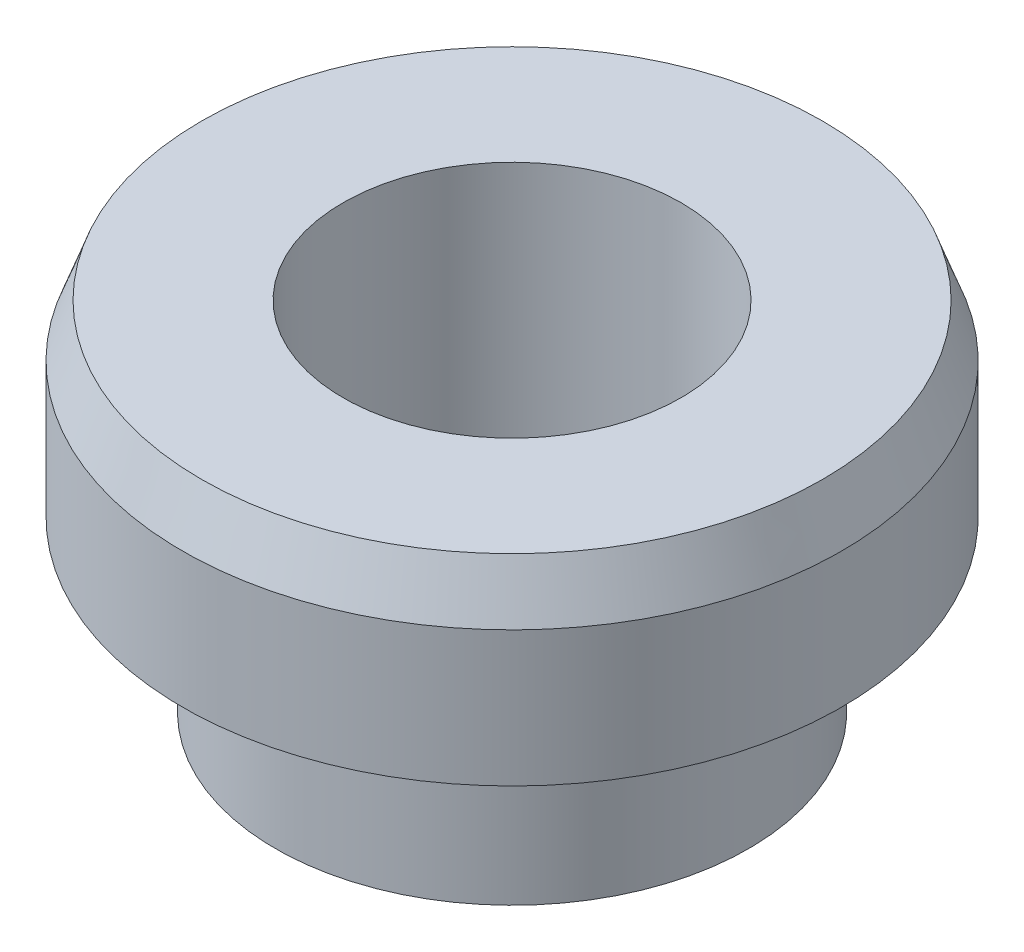
ISO-10303-21;
HEADER;
FILE_DESCRIPTION(('STEP AP214'),'2;1');
FILE_NAME('part.step','',(''),(''),'','','');
FILE_SCHEMA(('AUTOMOTIVE_DESIGN { 1 0 10303 214 1 1 1 1 }'));
ENDSEC;
DATA;
#1=APPLICATION_CONTEXT('core data for automotive mechanical design processes');
#2=APPLICATION_PROTOCOL_DEFINITION('international standard','automotive_design',2000,#1);
#3=PRODUCT_CONTEXT('',#1,'mechanical');
#4=PRODUCT('Part','Part','',(#3));
#5=PRODUCT_RELATED_PRODUCT_CATEGORY('part','',(#4));
#6=PRODUCT_DEFINITION_FORMATION('','',#4);
#7=PRODUCT_DEFINITION_CONTEXT('part definition',#1,'design');
#8=PRODUCT_DEFINITION('design','',#6,#7);
#9=PRODUCT_DEFINITION_SHAPE('','',#8);
#10=(LENGTH_UNIT() NAMED_UNIT(*) SI_UNIT(.MILLI.,.METRE.));
#11=(NAMED_UNIT(*) PLANE_ANGLE_UNIT() SI_UNIT($,.RADIAN.));
#12=(NAMED_UNIT(*) SI_UNIT($,.STERADIAN.) SOLID_ANGLE_UNIT());
#13=UNCERTAINTY_MEASURE_WITH_UNIT(LENGTH_MEASURE(1.E-05),#10,'distance_accuracy_value','');
#14=(GEOMETRIC_REPRESENTATION_CONTEXT(3) GLOBAL_UNCERTAINTY_ASSIGNED_CONTEXT((#13)) GLOBAL_UNIT_ASSIGNED_CONTEXT((#10,
#11,#12)) REPRESENTATION_CONTEXT('',''));
#15=CARTESIAN_POINT('',(0.,0.,0.));
#16=DIRECTION('',(0.,0.,1.));
#17=DIRECTION('',(1.,0.,0.));
#18=AXIS2_PLACEMENT_3D('',#15,#16,#17);
#19=CARTESIAN_POINT('',(0.,0.,0.));
#20=DIRECTION('',(0.,-1.,0.));
#21=DIRECTION('',(0.,0.,-1.));
#22=AXIS2_PLACEMENT_3D('',#19,#20,#21);
#23=CYLINDRICAL_SURFACE('',#22,5.);
#24=CARTESIAN_POINT('',(0.,-0.0907886838824104,0.));
#25=DIRECTION('',(0.,-1.,0.));
#26=DIRECTION('',(0.,0.,-1.));
#27=AXIS2_PLACEMENT_3D('',#24,#25,#26);
#28=CIRCLE('',#27,5.);
#29=CARTESIAN_POINT('',(0.,-0.0907886838824104,-5.));
#30=VERTEX_POINT('',#29);
#31=EDGE_CURVE('E56',#30,#30,#28,.T.);
#32=ORIENTED_EDGE('',*,*,#31,.T.);
#33=EDGE_LOOP('',(#32));
#34=FACE_BOUND('',#33,.T.);
#35=CARTESIAN_POINT('',(0.,10.4617812182707,0.));
#36=DIRECTION('',(0.,-1.,0.));
#37=DIRECTION('',(0.,0.,-1.));
#38=AXIS2_PLACEMENT_3D('',#35,#36,#37);
#39=CIRCLE('',#38,5.);
#40=CARTESIAN_POINT('',(0.,10.4617812182707,-5.));
#41=VERTEX_POINT('',#40);
#42=EDGE_CURVE('E10',#41,#41,#39,.T.);
#43=ORIENTED_EDGE('',*,*,#42,.F.);
#44=EDGE_LOOP('',(#43));
#45=FACE_BOUND('',#44,.T.);
#46=ADVANCED_FACE('F31',(#34,#45),#23,.F.);
#47=CARTESIAN_POINT('',(5.,10.4617812182707,0.));
#48=DIRECTION('',(0.,1.,0.));
#49=DIRECTION('',(0.,0.,1.));
#50=AXIS2_PLACEMENT_3D('',#47,#48,#49);
#51=PLANE('',#50);
#52=ORIENTED_EDGE('',*,*,#42,.T.);
#53=EDGE_LOOP('',(#52));
#54=FACE_BOUND('',#53,.T.);
#55=CARTESIAN_POINT('',(0.,10.4617812182707,0.));
#56=DIRECTION('',(0.,-1.,0.));
#57=DIRECTION('',(0.,0.,-1.));
#58=AXIS2_PLACEMENT_3D('',#55,#56,#57);
#59=CIRCLE('',#58,9.18491076899867);
#60=CARTESIAN_POINT('',(0.,10.4617812182707,-9.18491076899867));
#61=VERTEX_POINT('',#60);
#62=EDGE_CURVE('E37',#61,#61,#59,.T.);
#63=ORIENTED_EDGE('',*,*,#62,.F.);
#64=EDGE_LOOP('',(#63));
#65=FACE_BOUND('',#64,.T.);
#66=ADVANCED_FACE('F74',(#54,#65),#51,.T.);
#67=CARTESIAN_POINT('',(0.,8.90921131611759,0.));
#68=DIRECTION('',(0.,-1.,0.));
#69=DIRECTION('',(0.,0.,-1.));
#70=AXIS2_PLACEMENT_3D('',#67,#68,#69);
#71=CONICAL_SURFACE('',#70,9.75,0.349065850398862);
#72=ORIENTED_EDGE('',*,*,#62,.T.);
#73=EDGE_LOOP('',(#72));
#74=FACE_BOUND('',#73,.T.);
#75=CARTESIAN_POINT('',(0.,8.90921131611759,0.));
#76=DIRECTION('',(0.,-1.,0.));
#77=DIRECTION('',(0.,0.,-1.));
#78=AXIS2_PLACEMENT_3D('',#75,#76,#77);
#79=CIRCLE('',#78,9.75);
#80=CARTESIAN_POINT('',(0.,8.90921131611759,-9.75));
#81=VERTEX_POINT('',#80);
#82=EDGE_CURVE('E41',#81,#81,#79,.T.);
#83=ORIENTED_EDGE('',*,*,#82,.F.);
#84=EDGE_LOOP('',(#83));
#85=FACE_BOUND('',#84,.T.);
#86=ADVANCED_FACE('F78',(#74,#85),#71,.T.);
#87=CARTESIAN_POINT('',(0.,0.,0.));
#88=DIRECTION('',(0.,-1.,0.));
#89=DIRECTION('',(0.,0.,-1.));
#90=AXIS2_PLACEMENT_3D('',#87,#88,#89);
#91=CYLINDRICAL_SURFACE('',#90,9.75);
#92=ORIENTED_EDGE('',*,*,#82,.T.);
#93=EDGE_LOOP('',(#92));
#94=FACE_BOUND('',#93,.T.);
#95=CARTESIAN_POINT('',(0.,4.90921131611759,0.));
#96=DIRECTION('',(0.,-1.,0.));
#97=DIRECTION('',(0.,0.,-1.));
#98=AXIS2_PLACEMENT_3D('',#95,#96,#97);
#99=CIRCLE('',#98,9.75);
#100=CARTESIAN_POINT('',(0.,4.90921131611759,-9.75));
#101=VERTEX_POINT('',#100);
#102=EDGE_CURVE('E45',#101,#101,#99,.T.);
#103=ORIENTED_EDGE('',*,*,#102,.F.);
#104=EDGE_LOOP('',(#103));
#105=FACE_BOUND('',#104,.T.);
#106=ADVANCED_FACE('F82',(#94,#105),#91,.T.);
#107=CARTESIAN_POINT('',(9.75,4.90921131611759,0.));
#108=DIRECTION('',(0.,-1.,0.));
#109=DIRECTION('',(0.,0.,-1.));
#110=AXIS2_PLACEMENT_3D('',#107,#108,#109);
#111=PLANE('',#110);
#112=ORIENTED_EDGE('',*,*,#102,.T.);
#113=EDGE_LOOP('',(#112));
#114=FACE_BOUND('',#113,.T.);
#115=CARTESIAN_POINT('',(0.,4.90921131611759,0.));
#116=DIRECTION('',(0.,-1.,0.));
#117=DIRECTION('',(0.,0.,-1.));
#118=AXIS2_PLACEMENT_3D('',#115,#116,#117);
#119=CIRCLE('',#118,7.);
#120=CARTESIAN_POINT('',(0.,4.90921131611759,-7.));
#121=VERTEX_POINT('',#120);
#122=EDGE_CURVE('E50',#121,#121,#119,.T.);
#123=ORIENTED_EDGE('',*,*,#122,.F.);
#124=EDGE_LOOP('',(#123));
#125=FACE_BOUND('',#124,.T.);
#126=ADVANCED_FACE('F70',(#114,#125),#111,.T.);
#127=CARTESIAN_POINT('',(0.,0.,0.));
#128=DIRECTION('',(0.,-1.,0.));
#129=DIRECTION('',(0.,0.,-1.));
#130=AXIS2_PLACEMENT_3D('',#127,#128,#129);
#131=CYLINDRICAL_SURFACE('',#130,7.);
#132=ORIENTED_EDGE('',*,*,#122,.T.);
#133=EDGE_LOOP('',(#132));
#134=FACE_BOUND('',#133,.T.);
#135=CARTESIAN_POINT('',(0.,-0.0907886838824102,0.));
#136=DIRECTION('',(0.,-1.,0.));
#137=DIRECTION('',(0.,0.,-1.));
#138=AXIS2_PLACEMENT_3D('',#135,#136,#137);
#139=CIRCLE('',#138,7.);
#140=CARTESIAN_POINT('',(0.,-0.0907886838824102,-7.));
#141=VERTEX_POINT('',#140);
#142=EDGE_CURVE('E53',#141,#141,#139,.T.);
#143=ORIENTED_EDGE('',*,*,#142,.F.);
#144=EDGE_LOOP('',(#143));
#145=FACE_BOUND('',#144,.T.);
#146=ADVANCED_FACE('F64',(#134,#145),#131,.T.);
#147=CARTESIAN_POINT('',(7.,-0.0907886838824103,0.));
#148=DIRECTION('',(0.,-1.,0.));
#149=DIRECTION('',(0.,0.,-1.));
#150=AXIS2_PLACEMENT_3D('',#147,#148,#149);
#151=PLANE('',#150);
#152=ORIENTED_EDGE('',*,*,#142,.T.);
#153=EDGE_LOOP('',(#152));
#154=FACE_BOUND('',#153,.T.);
#155=ORIENTED_EDGE('',*,*,#31,.F.);
#156=EDGE_LOOP('',(#155));
#157=FACE_BOUND('',#156,.T.);
#158=ADVANCED_FACE('F62',(#154,#157),#151,.T.);
#159=CLOSED_SHELL('',(#46,#66,#86,#106,#126,#146,#158));
#160=MANIFOLD_SOLID_BREP('B2',#159);
#161=ADVANCED_BREP_SHAPE_REPRESENTATION('',(#18,#160),#14);
#162=SHAPE_DEFINITION_REPRESENTATION(#9,#161);
ENDSEC;
END-ISO-10303-21;
